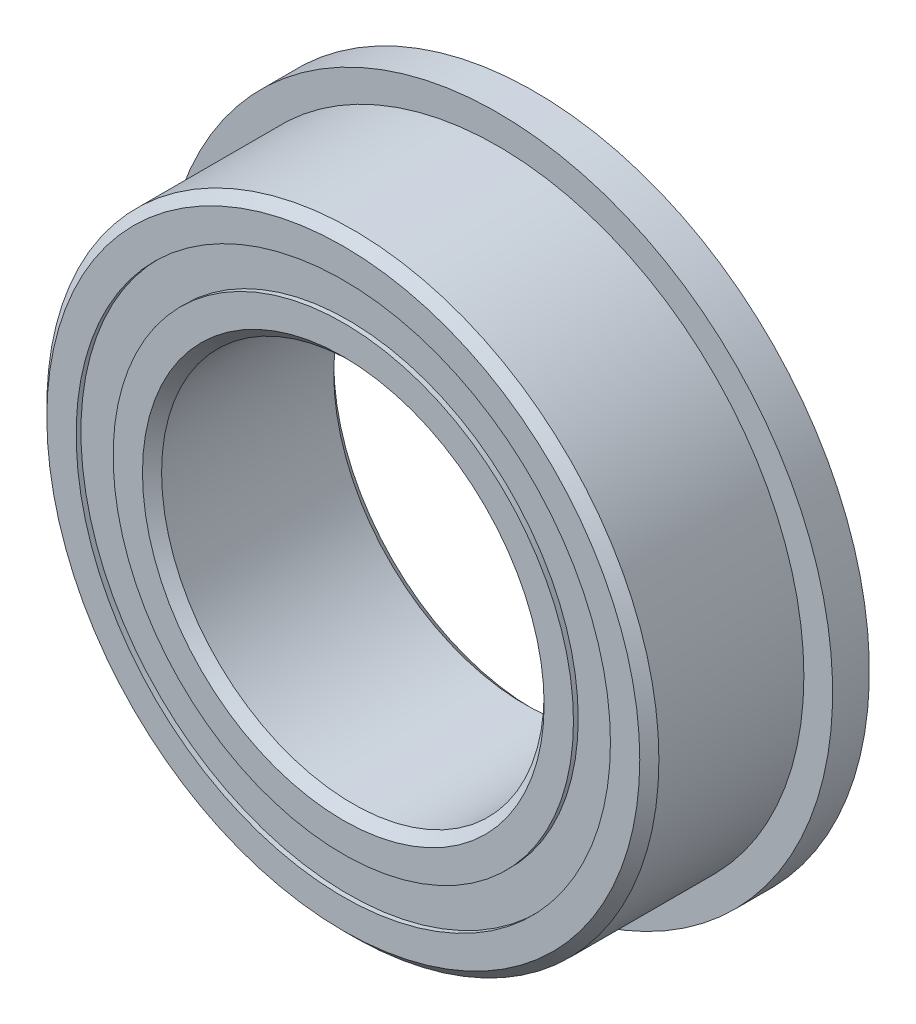
ISO-10303-21;
HEADER;
FILE_DESCRIPTION(('STEP AP214'),'2;1');
FILE_NAME('part.step','',(''),(''),'','','');
FILE_SCHEMA(('AUTOMOTIVE_DESIGN { 1 0 10303 214 1 1 1 1 }'));
ENDSEC;
DATA;
#1=APPLICATION_CONTEXT('core data for automotive mechanical design processes');
#2=APPLICATION_PROTOCOL_DEFINITION('international standard','automotive_design',2000,#1);
#3=PRODUCT_CONTEXT('',#1,'mechanical');
#4=PRODUCT('Part','Part','',(#3));
#5=PRODUCT_RELATED_PRODUCT_CATEGORY('part','',(#4));
#6=PRODUCT_DEFINITION_FORMATION('','',#4);
#7=PRODUCT_DEFINITION_CONTEXT('part definition',#1,'design');
#8=PRODUCT_DEFINITION('design','',#6,#7);
#9=PRODUCT_DEFINITION_SHAPE('','',#8);
#10=(LENGTH_UNIT() NAMED_UNIT(*) SI_UNIT(.MILLI.,.METRE.));
#11=(NAMED_UNIT(*) PLANE_ANGLE_UNIT() SI_UNIT($,.RADIAN.));
#12=(NAMED_UNIT(*) SI_UNIT($,.STERADIAN.) SOLID_ANGLE_UNIT());
#13=UNCERTAINTY_MEASURE_WITH_UNIT(LENGTH_MEASURE(1.E-05),#10,'distance_accuracy_value','');
#14=(GEOMETRIC_REPRESENTATION_CONTEXT(3) GLOBAL_UNCERTAINTY_ASSIGNED_CONTEXT((#13)) GLOBAL_UNIT_ASSIGNED_CONTEXT((#10,
#11,#12)) REPRESENTATION_CONTEXT('',''));
#15=CARTESIAN_POINT('',(0.,0.,0.));
#16=DIRECTION('',(0.,0.,1.));
#17=DIRECTION('',(1.,0.,0.));
#18=AXIS2_PLACEMENT_3D('',#15,#16,#17);
#19=CARTESIAN_POINT('',(0.,5.54316620879121,-1.88515625));
#20=DIRECTION('',(0.,0.,1.));
#21=DIRECTION('',(1.,0.,0.));
#22=AXIS2_PLACEMENT_3D('',#19,#20,#21);
#23=PLANE('',#22);
#24=CARTESIAN_POINT('',(0.,0.,-1.88515625));
#25=DIRECTION('',(0.,0.,1.));
#26=DIRECTION('',(1.,0.,0.));
#27=AXIS2_PLACEMENT_3D('',#24,#25,#26);
#28=CIRCLE('',#27,5.54316620879121);
#29=CARTESIAN_POINT('',(5.54316620879121,0.,-1.88515625));
#30=VERTEX_POINT('',#29);
#31=EDGE_CURVE('E60',#30,#30,#28,.T.);
#32=ORIENTED_EDGE('',*,*,#31,.F.);
#33=EDGE_LOOP('',(#32));
#34=FACE_BOUND('',#33,.T.);
#35=CARTESIAN_POINT('',(0.,0.,-1.88515625));
#36=DIRECTION('',(0.,0.,1.));
#37=DIRECTION('',(1.,0.,0.));
#38=AXIS2_PLACEMENT_3D('',#35,#36,#37);
#39=CIRCLE('',#38,4.77558379120879);
#40=CARTESIAN_POINT('',(4.77558379120879,0.,-1.88515625));
#41=VERTEX_POINT('',#40);
#42=EDGE_CURVE('E11',#41,#41,#39,.T.);
#43=ORIENTED_EDGE('',*,*,#42,.T.);
#44=EDGE_LOOP('',(#43));
#45=FACE_BOUND('',#44,.T.);
#46=ADVANCED_FACE('F46',(#34,#45),#23,.F.);
#47=CARTESIAN_POINT('',(0.,0.,1.984375));
#48=DIRECTION('',(0.,0.,1.));
#49=DIRECTION('',(1.,0.,0.));
#50=AXIS2_PLACEMENT_3D('',#47,#48,#49);
#51=CYLINDRICAL_SURFACE('',#50,4.77558379120879);
#52=ORIENTED_EDGE('',*,*,#42,.F.);
#53=EDGE_LOOP('',(#52));
#54=FACE_BOUND('',#53,.T.);
#55=CARTESIAN_POINT('',(0.,0.,-0.961832467237323));
#56=DIRECTION('',(0.,0.,1.));
#57=DIRECTION('',(1.,0.,0.));
#58=AXIS2_PLACEMENT_3D('',#55,#56,#57);
#59=CIRCLE('',#58,4.77558379120879);
#60=CARTESIAN_POINT('',(4.77558379120879,0.,-0.961832467237323));
#61=VERTEX_POINT('',#60);
#62=EDGE_CURVE('E52',#61,#61,#59,.T.);
#63=ORIENTED_EDGE('',*,*,#62,.T.);
#64=EDGE_LOOP('',(#63));
#65=FACE_BOUND('',#64,.T.);
#66=ADVANCED_FACE('F69',(#54,#65),#51,.F.);
#67=CARTESIAN_POINT('',(0.,5.54316620879121,-0.961832467237323));
#68=DIRECTION('',(0.,0.,-1.));
#69=DIRECTION('',(-1.,0.,0.));
#70=AXIS2_PLACEMENT_3D('',#67,#68,#69);
#71=PLANE('',#70);
#72=ORIENTED_EDGE('',*,*,#62,.F.);
#73=EDGE_LOOP('',(#72));
#74=FACE_BOUND('',#73,.T.);
#75=CARTESIAN_POINT('',(0.,0.,-0.961832467237323));
#76=DIRECTION('',(0.,0.,1.));
#77=DIRECTION('',(1.,0.,0.));
#78=AXIS2_PLACEMENT_3D('',#75,#76,#77);
#79=CIRCLE('',#78,5.54316620879121);
#80=CARTESIAN_POINT('',(5.54316620879121,0.,-0.961832467237323));
#81=VERTEX_POINT('',#80);
#82=EDGE_CURVE('E56',#81,#81,#79,.T.);
#83=ORIENTED_EDGE('',*,*,#82,.T.);
#84=EDGE_LOOP('',(#83));
#85=FACE_BOUND('',#84,.T.);
#86=ADVANCED_FACE('F73',(#74,#85),#71,.F.);
#87=CARTESIAN_POINT('',(0.,0.,1.984375));
#88=DIRECTION('',(0.,0.,1.));
#89=DIRECTION('',(1.,0.,0.));
#90=AXIS2_PLACEMENT_3D('',#87,#88,#89);
#91=CYLINDRICAL_SURFACE('',#90,5.54316620879121);
#92=ORIENTED_EDGE('',*,*,#82,.F.);
#93=EDGE_LOOP('',(#92));
#94=FACE_BOUND('',#93,.T.);
#95=ORIENTED_EDGE('',*,*,#31,.T.);
#96=EDGE_LOOP('',(#95));
#97=FACE_BOUND('',#96,.T.);
#98=ADVANCED_FACE('F66',(#94,#97),#91,.T.);
#99=CLOSED_SHELL('',(#46,#66,#86,#98));
#100=MANIFOLD_SOLID_BREP('B2',#99);
#101=CARTESIAN_POINT('',(0.,5.54316620879121,1.88515625));
#102=DIRECTION('',(0.,0.,-1.));
#103=DIRECTION('',(-1.,0.,0.));
#104=AXIS2_PLACEMENT_3D('',#101,#102,#103);
#105=PLANE('',#104);
#106=CARTESIAN_POINT('',(0.,0.,1.88515625));
#107=DIRECTION('',(0.,0.,1.));
#108=DIRECTION('',(1.,0.,0.));
#109=AXIS2_PLACEMENT_3D('',#106,#107,#108);
#110=CIRCLE('',#109,4.77558379120879);
#111=CARTESIAN_POINT('',(4.77558379120879,0.,1.88515625));
#112=VERTEX_POINT('',#111);
#113=EDGE_CURVE('E45',#112,#112,#110,.T.);
#114=ORIENTED_EDGE('',*,*,#113,.F.);
#115=EDGE_LOOP('',(#114));
#116=FACE_BOUND('',#115,.T.);
#117=CARTESIAN_POINT('',(0.,0.,1.88515625));
#118=DIRECTION('',(0.,0.,1.));
#119=DIRECTION('',(1.,0.,0.));
#120=AXIS2_PLACEMENT_3D('',#117,#118,#119);
#121=CIRCLE('',#120,5.54316620879121);
#122=CARTESIAN_POINT('',(5.54316620879121,0.,1.88515625));
#123=VERTEX_POINT('',#122);
#124=EDGE_CURVE('E128',#123,#123,#121,.T.);
#125=ORIENTED_EDGE('',*,*,#124,.T.);
#126=EDGE_LOOP('',(#125));
#127=FACE_BOUND('',#126,.T.);
#128=ADVANCED_FACE('F114',(#116,#127),#105,.F.);
#129=CARTESIAN_POINT('',(0.,0.,1.984375));
#130=DIRECTION('',(0.,0.,1.));
#131=DIRECTION('',(1.,0.,0.));
#132=AXIS2_PLACEMENT_3D('',#129,#130,#131);
#133=CYLINDRICAL_SURFACE('',#132,4.77558379120879);
#134=CARTESIAN_POINT('',(0.,0.,0.961832467237323));
#135=DIRECTION('',(0.,0.,1.));
#136=DIRECTION('',(1.,0.,0.));
#137=AXIS2_PLACEMENT_3D('',#134,#135,#136);
#138=CIRCLE('',#137,4.77558379120879);
#139=CARTESIAN_POINT('',(4.77558379120879,0.,0.961832467237323));
#140=VERTEX_POINT('',#139);
#141=EDGE_CURVE('E120',#140,#140,#138,.T.);
#142=ORIENTED_EDGE('',*,*,#141,.F.);
#143=EDGE_LOOP('',(#142));
#144=FACE_BOUND('',#143,.T.);
#145=ORIENTED_EDGE('',*,*,#113,.T.);
#146=EDGE_LOOP('',(#145));
#147=FACE_BOUND('',#146,.T.);
#148=ADVANCED_FACE('F143',(#144,#147),#133,.F.);
#149=CARTESIAN_POINT('',(0.,5.54316620879121,0.961832467237323));
#150=DIRECTION('',(0.,0.,1.));
#151=DIRECTION('',(1.,0.,0.));
#152=AXIS2_PLACEMENT_3D('',#149,#150,#151);
#153=PLANE('',#152);
#154=CARTESIAN_POINT('',(0.,0.,0.961832467237323));
#155=DIRECTION('',(0.,0.,1.));
#156=DIRECTION('',(1.,0.,0.));
#157=AXIS2_PLACEMENT_3D('',#154,#155,#156);
#158=CIRCLE('',#157,5.54316620879121);
#159=CARTESIAN_POINT('',(5.54316620879121,0.,0.961832467237323));
#160=VERTEX_POINT('',#159);
#161=EDGE_CURVE('E124',#160,#160,#158,.T.);
#162=ORIENTED_EDGE('',*,*,#161,.F.);
#163=EDGE_LOOP('',(#162));
#164=FACE_BOUND('',#163,.T.);
#165=ORIENTED_EDGE('',*,*,#141,.T.);
#166=EDGE_LOOP('',(#165));
#167=FACE_BOUND('',#166,.T.);
#168=ADVANCED_FACE('F138',(#164,#167),#153,.F.);
#169=CARTESIAN_POINT('',(0.,0.,1.984375));
#170=DIRECTION('',(0.,0.,1.));
#171=DIRECTION('',(1.,0.,0.));
#172=AXIS2_PLACEMENT_3D('',#169,#170,#171);
#173=CYLINDRICAL_SURFACE('',#172,5.54316620879121);
#174=ORIENTED_EDGE('',*,*,#124,.F.);
#175=EDGE_LOOP('',(#174));
#176=FACE_BOUND('',#175,.T.);
#177=ORIENTED_EDGE('',*,*,#161,.T.);
#178=EDGE_LOOP('',(#177));
#179=FACE_BOUND('',#178,.T.);
#180=ADVANCED_FACE('F135',(#176,#179),#173,.T.);
#181=CLOSED_SHELL('',(#128,#148,#168,#180));
#182=MANIFOLD_SOLID_BREP('B6',#181);
#183=CARTESIAN_POINT('',(-1.97440733385857,4.76664096305045,0.));
#184=DIRECTION('',(0.,0.,1.));
#185=DIRECTION('',(-0.382683432365077,0.923879532511292,0.));
#186=AXIS2_PLACEMENT_3D('',#183,#184,#185);
#187=SPHERICAL_SURFACE('',#186,0.961832467237323);
#188=CARTESIAN_POINT('',(-1.97440733385857,4.76664096305045,0.961832467237323));
#189=VERTEX_POINT('',#188);
#190=VERTEX_LOOP('',#189);
#191=FACE_BOUND('',#190,.T.);
#192=ADVANCED_FACE('F182',(#191),#187,.T.);
#193=CLOSED_SHELL('',(#192));
#194=MANIFOLD_SOLID_BREP('B40',#193);
#195=CARTESIAN_POINT('',(-3.6482290491843,3.64822904918439,0.));
#196=DIRECTION('',(0.,0.,1.));
#197=DIRECTION('',(-0.707106781186539,0.707106781186556,0.));
#198=AXIS2_PLACEMENT_3D('',#195,#196,#197);
#199=SPHERICAL_SURFACE('',#198,0.961832467237323);
#200=CARTESIAN_POINT('',(-3.6482290491843,3.64822904918439,0.961832467237323));
#201=VERTEX_POINT('',#200);
#202=VERTEX_LOOP('',#201);
#203=FACE_BOUND('',#202,.T.);
#204=ADVANCED_FACE('F203',(#203),#199,.T.);
#205=CLOSED_SHELL('',(#204));
#206=MANIFOLD_SOLID_BREP('B110',#205);
#207=CARTESIAN_POINT('',(-4.7666409630504,1.97440733385869,0.));
#208=DIRECTION('',(0.,0.,1.));
#209=DIRECTION('',(-0.923879532511283,0.3826834323651,0.));
#210=AXIS2_PLACEMENT_3D('',#207,#208,#209);
#211=SPHERICAL_SURFACE('',#210,0.961832467237323);
#212=CARTESIAN_POINT('',(-4.7666409630504,1.97440733385869,0.961832467237323));
#213=VERTEX_POINT('',#212);
#214=VERTEX_LOOP('',#213);
#215=FACE_BOUND('',#214,.T.);
#216=ADVANCED_FACE('F224',(#215),#211,.T.);
#217=CLOSED_SHELL('',(#216));
#218=MANIFOLD_SOLID_BREP('B178',#217);
#219=CARTESIAN_POINT('',(-5.159375,0.,0.));
#220=DIRECTION('',(0.,0.,1.));
#221=DIRECTION('',(-1.,0.,0.));
#222=AXIS2_PLACEMENT_3D('',#219,#220,#221);
#223=SPHERICAL_SURFACE('',#222,0.961832467237323);
#224=CARTESIAN_POINT('',(-5.159375,0.,0.961832467237323));
#225=VERTEX_POINT('',#224);
#226=VERTEX_LOOP('',#225);
#227=FACE_BOUND('',#226,.T.);
#228=ADVANCED_FACE('F245',(#227),#223,.T.);
#229=CLOSED_SHELL('',(#228));
#230=MANIFOLD_SOLID_BREP('B199',#229);
#231=CARTESIAN_POINT('',(-4.76664096305044,-1.97440733385859,0.));
#232=DIRECTION('',(0.,0.,1.));
#233=DIRECTION('',(-0.923879532511291,-0.382683432365081,0.));
#234=AXIS2_PLACEMENT_3D('',#231,#232,#233);
#235=SPHERICAL_SURFACE('',#234,0.961832467237323);
#236=CARTESIAN_POINT('',(-4.76664096305044,-1.97440733385859,0.961832467237323));
#237=VERTEX_POINT('',#236);
#238=VERTEX_LOOP('',#237);
#239=FACE_BOUND('',#238,.T.);
#240=ADVANCED_FACE('F266',(#239),#235,.T.);
#241=CLOSED_SHELL('',(#240));
#242=MANIFOLD_SOLID_BREP('B220',#241);
#243=CARTESIAN_POINT('',(-3.64822904918437,-3.64822904918431,0.));
#244=DIRECTION('',(0.,0.,1.));
#245=DIRECTION('',(-0.707106781186554,-0.707106781186541,0.));
#246=AXIS2_PLACEMENT_3D('',#243,#244,#245);
#247=SPHERICAL_SURFACE('',#246,0.961832467237323);
#248=CARTESIAN_POINT('',(-3.64822904918437,-3.64822904918431,0.961832467237323));
#249=VERTEX_POINT('',#248);
#250=VERTEX_LOOP('',#249);
#251=FACE_BOUND('',#250,.T.);
#252=ADVANCED_FACE('F287',(#251),#247,.T.);
#253=CLOSED_SHELL('',(#252));
#254=MANIFOLD_SOLID_BREP('B241',#253);
#255=CARTESIAN_POINT('',(-1.97440733385867,-4.7666409630504,0.));
#256=DIRECTION('',(0.,0.,1.));
#257=DIRECTION('',(-0.382683432365097,-0.923879532511284,0.));
#258=AXIS2_PLACEMENT_3D('',#255,#256,#257);
#259=SPHERICAL_SURFACE('',#258,0.961832467237323);
#260=CARTESIAN_POINT('',(-1.97440733385867,-4.7666409630504,0.961832467237323));
#261=VERTEX_POINT('',#260);
#262=VERTEX_LOOP('',#261);
#263=FACE_BOUND('',#262,.T.);
#264=ADVANCED_FACE('F308',(#263),#259,.T.);
#265=CLOSED_SHELL('',(#264));
#266=MANIFOLD_SOLID_BREP('B262',#265);
#267=CARTESIAN_POINT('',(0.,-5.159375,0.));
#268=DIRECTION('',(0.,0.,1.));
#269=DIRECTION('',(0.,-1.,0.));
#270=AXIS2_PLACEMENT_3D('',#267,#268,#269);
#271=SPHERICAL_SURFACE('',#270,0.961832467237323);
#272=CARTESIAN_POINT('',(0.,-5.159375,0.961832467237323));
#273=VERTEX_POINT('',#272);
#274=VERTEX_LOOP('',#273);
#275=FACE_BOUND('',#274,.T.);
#276=ADVANCED_FACE('F329',(#275),#271,.T.);
#277=CLOSED_SHELL('',(#276));
#278=MANIFOLD_SOLID_BREP('B283',#277);
#279=CARTESIAN_POINT('',(1.97440733385861,-4.76664096305043,0.));
#280=DIRECTION('',(0.,0.,1.));
#281=DIRECTION('',(0.382683432365084,-0.923879532511289,0.));
#282=AXIS2_PLACEMENT_3D('',#279,#280,#281);
#283=SPHERICAL_SURFACE('',#282,0.961832467237323);
#284=CARTESIAN_POINT('',(1.97440733385861,-4.76664096305043,0.961832467237323));
#285=VERTEX_POINT('',#284);
#286=VERTEX_LOOP('',#285);
#287=FACE_BOUND('',#286,.T.);
#288=ADVANCED_FACE('F350',(#287),#283,.T.);
#289=CLOSED_SHELL('',(#288));
#290=MANIFOLD_SOLID_BREP('B304',#289);
#291=CARTESIAN_POINT('',(3.64822904918432,-3.64822904918436,0.));
#292=DIRECTION('',(0.,0.,1.));
#293=DIRECTION('',(0.707106781186544,-0.707106781186551,0.));
#294=AXIS2_PLACEMENT_3D('',#291,#292,#293);
#295=SPHERICAL_SURFACE('',#294,0.961832467237323);
#296=CARTESIAN_POINT('',(3.64822904918432,-3.64822904918436,0.961832467237323));
#297=VERTEX_POINT('',#296);
#298=VERTEX_LOOP('',#297);
#299=FACE_BOUND('',#298,.T.);
#300=ADVANCED_FACE('F371',(#299),#295,.T.);
#301=CLOSED_SHELL('',(#300));
#302=MANIFOLD_SOLID_BREP('B325',#301);
#303=CARTESIAN_POINT('',(4.76664096305041,-1.97440733385866,0.));
#304=DIRECTION('',(0.,0.,1.));
#305=DIRECTION('',(0.923879532511285,-0.382683432365094,0.));
#306=AXIS2_PLACEMENT_3D('',#303,#304,#305);
#307=SPHERICAL_SURFACE('',#306,0.961832467237323);
#308=CARTESIAN_POINT('',(4.76664096305041,-1.97440733385866,0.961832467237323));
#309=VERTEX_POINT('',#308);
#310=VERTEX_LOOP('',#309);
#311=FACE_BOUND('',#310,.T.);
#312=ADVANCED_FACE('F392',(#311),#307,.T.);
#313=CLOSED_SHELL('',(#312));
#314=MANIFOLD_SOLID_BREP('B346',#313);
#315=CARTESIAN_POINT('',(5.159375,0.,0.));
#316=DIRECTION('',(0.,0.,1.));
#317=DIRECTION('',(1.,0.,0.));
#318=AXIS2_PLACEMENT_3D('',#315,#316,#317);
#319=SPHERICAL_SURFACE('',#318,0.961832467237323);
#320=CARTESIAN_POINT('',(5.159375,0.,0.961832467237323));
#321=VERTEX_POINT('',#320);
#322=VERTEX_LOOP('',#321);
#323=FACE_BOUND('',#322,.T.);
#324=ADVANCED_FACE('F413',(#323),#319,.T.);
#325=CLOSED_SHELL('',(#324));
#326=MANIFOLD_SOLID_BREP('B367',#325);
#327=CARTESIAN_POINT('',(4.76664096305042,1.97440733385862,0.));
#328=DIRECTION('',(0.,0.,1.));
#329=DIRECTION('',(0.923879532511288,0.382683432365087,0.));
#330=AXIS2_PLACEMENT_3D('',#327,#328,#329);
#331=SPHERICAL_SURFACE('',#330,0.961832467237323);
#332=CARTESIAN_POINT('',(4.76664096305042,1.97440733385862,0.961832467237323));
#333=VERTEX_POINT('',#332);
#334=VERTEX_LOOP('',#333);
#335=FACE_BOUND('',#334,.T.);
#336=ADVANCED_FACE('F434',(#335),#331,.T.);
#337=CLOSED_SHELL('',(#336));
#338=MANIFOLD_SOLID_BREP('B388',#337);
#339=CARTESIAN_POINT('',(3.64822904918435,3.64822904918434,0.));
#340=DIRECTION('',(0.,0.,1.));
#341=DIRECTION('',(0.707106781186549,0.707106781186546,0.));
#342=AXIS2_PLACEMENT_3D('',#339,#340,#341);
#343=SPHERICAL_SURFACE('',#342,0.961832467237323);
#344=CARTESIAN_POINT('',(3.64822904918435,3.64822904918434,0.961832467237323));
#345=VERTEX_POINT('',#344);
#346=VERTEX_LOOP('',#345);
#347=FACE_BOUND('',#346,.T.);
#348=ADVANCED_FACE('F455',(#347),#343,.T.);
#349=CLOSED_SHELL('',(#348));
#350=MANIFOLD_SOLID_BREP('B409',#349);
#351=CARTESIAN_POINT('',(1.97440733385864,4.76664096305042,0.));
#352=DIRECTION('',(0.,0.,1.));
#353=DIRECTION('',(0.382683432365091,0.923879532511287,0.));
#354=AXIS2_PLACEMENT_3D('',#351,#352,#353);
#355=SPHERICAL_SURFACE('',#354,0.961832467237323);
#356=CARTESIAN_POINT('',(1.97440733385864,4.76664096305042,0.961832467237323));
#357=VERTEX_POINT('',#356);
#358=VERTEX_LOOP('',#357);
#359=FACE_BOUND('',#358,.T.);
#360=ADVANCED_FACE('F476',(#359),#355,.T.);
#361=CLOSED_SHELL('',(#360));
#362=MANIFOLD_SOLID_BREP('B430',#361);
#363=CARTESIAN_POINT('',(0.,5.159375,0.));
#364=DIRECTION('',(0.,0.,1.));
#365=DIRECTION('',(0.,1.,0.));
#366=AXIS2_PLACEMENT_3D('',#363,#364,#365);
#367=SPHERICAL_SURFACE('',#366,0.961832467237323);
#368=CARTESIAN_POINT('',(0.,5.159375,0.961832467237323));
#369=VERTEX_POINT('',#368);
#370=VERTEX_LOOP('',#369);
#371=FACE_BOUND('',#370,.T.);
#372=ADVANCED_FACE('F499',(#371),#367,.T.);
#373=CLOSED_SHELL('',(#372));
#374=MANIFOLD_SOLID_BREP('B451',#373);
#375=CARTESIAN_POINT('',(0.,4.77558379120879,1.984375));
#376=DIRECTION('',(0.,0.,-1.));
#377=DIRECTION('',(-1.,0.,0.));
#378=AXIS2_PLACEMENT_3D('',#375,#376,#377);
#379=PLANE('',#378);
#380=CARTESIAN_POINT('',(0.,0.,1.984375));
#381=DIRECTION('',(0.,0.,1.));
#382=DIRECTION('',(1.,0.,0.));
#383=AXIS2_PLACEMENT_3D('',#380,#381,#382);
#384=CIRCLE('',#383,4.1671875);
#385=CARTESIAN_POINT('',(4.1671875,0.,1.984375));
#386=VERTEX_POINT('',#385);
#387=EDGE_CURVE('E547',#386,#386,#384,.T.);
#388=ORIENTED_EDGE('',*,*,#387,.F.);
#389=EDGE_LOOP('',(#388));
#390=FACE_BOUND('',#389,.T.);
#391=CARTESIAN_POINT('',(0.,0.,1.984375));
#392=DIRECTION('',(0.,0.,1.));
#393=DIRECTION('',(1.,0.,0.));
#394=AXIS2_PLACEMENT_3D('',#391,#392,#393);
#395=CIRCLE('',#394,4.77558379120879);
#396=CARTESIAN_POINT('',(4.77558379120879,0.,1.984375));
#397=VERTEX_POINT('',#396);
#398=EDGE_CURVE('E498',#397,#397,#395,.T.);
#399=ORIENTED_EDGE('',*,*,#398,.T.);
#400=EDGE_LOOP('',(#399));
#401=FACE_BOUND('',#400,.T.);
#402=ADVANCED_FACE('F519',(#390,#401),#379,.F.);
#403=CARTESIAN_POINT('',(0.,0.,1.984375));
#404=DIRECTION('',(0.,0.,1.));
#405=DIRECTION('',(1.,0.,0.));
#406=AXIS2_PLACEMENT_3D('',#403,#404,#405);
#407=CYLINDRICAL_SURFACE('',#406,4.77558379120879);
#408=ORIENTED_EDGE('',*,*,#398,.F.);
#409=EDGE_LOOP('',(#408));
#410=FACE_BOUND('',#409,.T.);
#411=CARTESIAN_POINT('',(0.,0.,0.881944444444444));
#412=DIRECTION('',(0.,0.,1.));
#413=DIRECTION('',(1.,0.,0.));
#414=AXIS2_PLACEMENT_3D('',#411,#412,#413);
#415=CIRCLE('',#414,4.77558379120879);
#416=CARTESIAN_POINT('',(4.77558379120879,0.,0.881944444444444));
#417=VERTEX_POINT('',#416);
#418=EDGE_CURVE('E525',#417,#417,#415,.T.);
#419=ORIENTED_EDGE('',*,*,#418,.T.);
#420=EDGE_LOOP('',(#419));
#421=FACE_BOUND('',#420,.T.);
#422=ADVANCED_FACE('F554',(#410,#421),#407,.T.);
#423=CARTESIAN_POINT('',(0.,0.,0.));
#424=DIRECTION('',(0.,0.,1.));
#425=DIRECTION('',(1.,0.,0.));
#426=AXIS2_PLACEMENT_3D('',#423,#424,#425);
#427=TOROIDAL_SURFACE('',#426,5.159375,0.961832467237321);
#428=ORIENTED_EDGE('',*,*,#418,.F.);
#429=EDGE_LOOP('',(#428));
#430=FACE_BOUND('',#429,.T.);
#431=CARTESIAN_POINT('',(0.,0.,-0.881944444444446));
#432=DIRECTION('',(0.,0.,1.));
#433=DIRECTION('',(1.,0.,0.));
#434=AXIS2_PLACEMENT_3D('',#431,#432,#433);
#435=CIRCLE('',#434,4.77558379120879);
#436=CARTESIAN_POINT('',(4.77558379120879,0.,-0.881944444444446));
#437=VERTEX_POINT('',#436);
#438=EDGE_CURVE('E529',#437,#437,#435,.T.);
#439=ORIENTED_EDGE('',*,*,#438,.T.);
#440=EDGE_LOOP('',(#439));
#441=FACE_BOUND('',#440,.T.);
#442=ADVANCED_FACE('F558',(#430,#441),#427,.F.);
#443=CARTESIAN_POINT('',(0.,0.,1.984375));
#444=DIRECTION('',(0.,0.,1.));
#445=DIRECTION('',(1.,0.,0.));
#446=AXIS2_PLACEMENT_3D('',#443,#444,#445);
#447=CYLINDRICAL_SURFACE('',#446,4.77558379120879);
#448=ORIENTED_EDGE('',*,*,#438,.F.);
#449=EDGE_LOOP('',(#448));
#450=FACE_BOUND('',#449,.T.);
#451=CARTESIAN_POINT('',(0.,0.,-1.984375));
#452=DIRECTION('',(0.,0.,1.));
#453=DIRECTION('',(1.,0.,0.));
#454=AXIS2_PLACEMENT_3D('',#451,#452,#453);
#455=CIRCLE('',#454,4.77558379120879);
#456=CARTESIAN_POINT('',(4.77558379120879,0.,-1.984375));
#457=VERTEX_POINT('',#456);
#458=EDGE_CURVE('E533',#457,#457,#455,.T.);
#459=ORIENTED_EDGE('',*,*,#458,.T.);
#460=EDGE_LOOP('',(#459));
#461=FACE_BOUND('',#460,.T.);
#462=ADVANCED_FACE('F563',(#450,#461),#447,.T.);
#463=CARTESIAN_POINT('',(0.,4.1671875,-1.984375));
#464=DIRECTION('',(0.,0.,1.));
#465=DIRECTION('',(1.,0.,0.));
#466=AXIS2_PLACEMENT_3D('',#463,#464,#465);
#467=PLANE('',#466);
#468=ORIENTED_EDGE('',*,*,#458,.F.);
#469=EDGE_LOOP('',(#468));
#470=FACE_BOUND('',#469,.T.);
#471=CARTESIAN_POINT('',(0.,0.,-1.984375));
#472=DIRECTION('',(0.,0.,1.));
#473=DIRECTION('',(1.,0.,0.));
#474=AXIS2_PLACEMENT_3D('',#471,#472,#473);
#475=CIRCLE('',#474,4.1671875);
#476=CARTESIAN_POINT('',(4.1671875,0.,-1.984375));
#477=VERTEX_POINT('',#476);
#478=EDGE_CURVE('E538',#477,#477,#475,.T.);
#479=ORIENTED_EDGE('',*,*,#478,.T.);
#480=EDGE_LOOP('',(#479));
#481=FACE_BOUND('',#480,.T.);
#482=ADVANCED_FACE('F569',(#470,#481),#467,.F.);
#483=CARTESIAN_POINT('',(0.,0.,-1.7859375));
#484=DIRECTION('',(0.,0.,-1.));
#485=DIRECTION('',(-1.,0.,0.));
#486=AXIS2_PLACEMENT_3D('',#483,#484,#485);
#487=CONICAL_SURFACE('',#486,3.96875,0.785398163397447);
#488=ORIENTED_EDGE('',*,*,#478,.F.);
#489=EDGE_LOOP('',(#488));
#490=FACE_BOUND('',#489,.T.);
#491=CARTESIAN_POINT('',(0.,0.,-1.7859375));
#492=DIRECTION('',(0.,0.,1.));
#493=DIRECTION('',(1.,0.,0.));
#494=AXIS2_PLACEMENT_3D('',#491,#492,#493);
#495=CIRCLE('',#494,3.96875);
#496=CARTESIAN_POINT('',(3.96875,0.,-1.7859375));
#497=VERTEX_POINT('',#496);
#498=EDGE_CURVE('E541',#497,#497,#495,.T.);
#499=ORIENTED_EDGE('',*,*,#498,.T.);
#500=EDGE_LOOP('',(#499));
#501=FACE_BOUND('',#500,.T.);
#502=ADVANCED_FACE('F573',(#490,#501),#487,.F.);
#503=CARTESIAN_POINT('',(0.,0.,1.984375));
#504=DIRECTION('',(0.,0.,1.));
#505=DIRECTION('',(1.,0.,0.));
#506=AXIS2_PLACEMENT_3D('',#503,#504,#505);
#507=CYLINDRICAL_SURFACE('',#506,3.96875);
#508=ORIENTED_EDGE('',*,*,#498,.F.);
#509=EDGE_LOOP('',(#508));
#510=FACE_BOUND('',#509,.T.);
#511=CARTESIAN_POINT('',(0.,0.,1.7859375));
#512=DIRECTION('',(0.,0.,1.));
#513=DIRECTION('',(1.,0.,0.));
#514=AXIS2_PLACEMENT_3D('',#511,#512,#513);
#515=CIRCLE('',#514,3.96875);
#516=CARTESIAN_POINT('',(3.96875,0.,1.7859375));
#517=VERTEX_POINT('',#516);
#518=EDGE_CURVE('E544',#517,#517,#515,.T.);
#519=ORIENTED_EDGE('',*,*,#518,.T.);
#520=EDGE_LOOP('',(#519));
#521=FACE_BOUND('',#520,.T.);
#522=ADVANCED_FACE('F577',(#510,#521),#507,.F.);
#523=CARTESIAN_POINT('',(0.,0.,1.984375));
#524=DIRECTION('',(0.,0.,1.));
#525=DIRECTION('',(1.,0.,0.));
#526=AXIS2_PLACEMENT_3D('',#523,#524,#525);
#527=CONICAL_SURFACE('',#526,4.1671875,0.78539816339745);
#528=ORIENTED_EDGE('',*,*,#518,.F.);
#529=EDGE_LOOP('',(#528));
#530=FACE_BOUND('',#529,.T.);
#531=ORIENTED_EDGE('',*,*,#387,.T.);
#532=EDGE_LOOP('',(#531));
#533=FACE_BOUND('',#532,.T.);
#534=ADVANCED_FACE('F551',(#530,#533),#527,.F.);
#535=CLOSED_SHELL('',(#402,#422,#442,#462,#482,#502,#522,#534));
#536=MANIFOLD_SOLID_BREP('B472',#535);
#537=CARTESIAN_POINT('',(0.,0.,1.7859375));
#538=DIRECTION('',(0.,0.,-1.));
#539=DIRECTION('',(-1.,0.,0.));
#540=AXIS2_PLACEMENT_3D('',#537,#538,#539);
#541=CONICAL_SURFACE('',#540,6.35,0.785398163397447);
#542=CARTESIAN_POINT('',(0.,0.,1.984375));
#543=DIRECTION('',(0.,0.,1.));
#544=DIRECTION('',(1.,0.,0.));
#545=AXIS2_PLACEMENT_3D('',#542,#543,#544);
#546=CIRCLE('',#545,6.1515625);
#547=CARTESIAN_POINT('',(6.1515625,0.,1.984375));
#548=VERTEX_POINT('',#547);
#549=EDGE_CURVE('E663',#548,#548,#546,.T.);
#550=ORIENTED_EDGE('',*,*,#549,.F.);
#551=EDGE_LOOP('',(#550));
#552=FACE_BOUND('',#551,.T.);
#553=CARTESIAN_POINT('',(0.,0.,1.7859375));
#554=DIRECTION('',(0.,0.,1.));
#555=DIRECTION('',(1.,0.,0.));
#556=AXIS2_PLACEMENT_3D('',#553,#554,#555);
#557=CIRCLE('',#556,6.35);
#558=CARTESIAN_POINT('',(6.35,0.,1.7859375));
#559=VERTEX_POINT('',#558);
#560=EDGE_CURVE('E518',#559,#559,#557,.T.);
#561=ORIENTED_EDGE('',*,*,#560,.T.);
#562=EDGE_LOOP('',(#561));
#563=FACE_BOUND('',#562,.T.);
#564=ADVANCED_FACE('F641',(#552,#563),#541,.T.);
#565=CARTESIAN_POINT('',(0.,0.,1.984375));
#566=DIRECTION('',(0.,0.,1.));
#567=DIRECTION('',(1.,0.,0.));
#568=AXIS2_PLACEMENT_3D('',#565,#566,#567);
#569=CYLINDRICAL_SURFACE('',#568,6.35);
#570=CARTESIAN_POINT('',(0.,0.,-1.222375));
#571=DIRECTION('',(0.,0.,1.));
#572=DIRECTION('',(1.,0.,0.));
#573=AXIS2_PLACEMENT_3D('',#570,#571,#572);
#574=CIRCLE('',#573,6.35);
#575=CARTESIAN_POINT('',(6.35,0.,-1.222375));
#576=VERTEX_POINT('',#575);
#577=EDGE_CURVE('E666',#576,#576,#574,.T.);
#578=ORIENTED_EDGE('',*,*,#577,.T.);
#579=EDGE_LOOP('',(#578));
#580=FACE_BOUND('',#579,.T.);
#581=ORIENTED_EDGE('',*,*,#560,.F.);
#582=EDGE_LOOP('',(#581));
#583=FACE_BOUND('',#582,.T.);
#584=ADVANCED_FACE('F686',(#580,#583),#569,.T.);
#585=CARTESIAN_POINT('',(0.,6.1515625,-1.984375));
#586=DIRECTION('',(0.,0.,1.));
#587=DIRECTION('',(1.,0.,0.));
#588=AXIS2_PLACEMENT_3D('',#585,#586,#587);
#589=PLANE('',#588);
#590=CARTESIAN_POINT('',(0.,0.,-1.984375));
#591=DIRECTION('',(0.,0.,1.));
#592=DIRECTION('',(1.,0.,0.));
#593=AXIS2_PLACEMENT_3D('',#590,#591,#592);
#594=CIRCLE('',#593,5.54316620879121);
#595=CARTESIAN_POINT('',(5.54316620879121,0.,-1.984375));
#596=VERTEX_POINT('',#595);
#597=EDGE_CURVE('E647',#596,#596,#594,.T.);
#598=ORIENTED_EDGE('',*,*,#597,.T.);
#599=EDGE_LOOP('',(#598));
#600=FACE_BOUND('',#599,.T.);
#601=CARTESIAN_POINT('',(0.,0.,-1.984375));
#602=DIRECTION('',(0.,0.,-1.));
#603=DIRECTION('',(-1.,0.,0.));
#604=AXIS2_PLACEMENT_3D('',#601,#602,#603);
#605=CIRCLE('',#604,6.9469);
#606=CARTESIAN_POINT('',(-6.9469,0.,-1.984375));
#607=VERTEX_POINT('',#606);
#608=EDGE_CURVE('E669',#607,#607,#605,.T.);
#609=ORIENTED_EDGE('',*,*,#608,.T.);
#610=EDGE_LOOP('',(#609));
#611=FACE_BOUND('',#610,.T.);
#612=ADVANCED_FACE('F689',(#600,#611),#589,.F.);
#613=CARTESIAN_POINT('',(0.,0.,1.984375));
#614=DIRECTION('',(0.,0.,1.));
#615=DIRECTION('',(1.,0.,0.));
#616=AXIS2_PLACEMENT_3D('',#613,#614,#615);
#617=CYLINDRICAL_SURFACE('',#616,5.54316620879121);
#618=CARTESIAN_POINT('',(0.,0.,-0.881944444444445));
#619=DIRECTION('',(0.,0.,1.));
#620=DIRECTION('',(1.,0.,0.));
#621=AXIS2_PLACEMENT_3D('',#618,#619,#620);
#622=CIRCLE('',#621,5.54316620879121);
#623=CARTESIAN_POINT('',(5.54316620879121,0.,-0.881944444444445));
#624=VERTEX_POINT('',#623);
#625=EDGE_CURVE('E651',#624,#624,#622,.T.);
#626=ORIENTED_EDGE('',*,*,#625,.T.);
#627=EDGE_LOOP('',(#626));
#628=FACE_BOUND('',#627,.T.);
#629=ORIENTED_EDGE('',*,*,#597,.F.);
#630=EDGE_LOOP('',(#629));
#631=FACE_BOUND('',#630,.T.);
#632=ADVANCED_FACE('F694',(#628,#631),#617,.F.);
#633=CARTESIAN_POINT('',(0.,0.,0.));
#634=DIRECTION('',(0.,0.,1.));
#635=DIRECTION('',(1.,0.,0.));
#636=AXIS2_PLACEMENT_3D('',#633,#634,#635);
#637=TOROIDAL_SURFACE('',#636,5.159375,0.961832467237323);
#638=ORIENTED_EDGE('',*,*,#625,.F.);
#639=EDGE_LOOP('',(#638));
#640=FACE_BOUND('',#639,.T.);
#641=CARTESIAN_POINT('',(0.,0.,0.881944444444444));
#642=DIRECTION('',(0.,0.,1.));
#643=DIRECTION('',(1.,0.,0.));
#644=AXIS2_PLACEMENT_3D('',#641,#642,#643);
#645=CIRCLE('',#644,5.54316620879121);
#646=CARTESIAN_POINT('',(5.54316620879121,0.,0.881944444444444));
#647=VERTEX_POINT('',#646);
#648=EDGE_CURVE('E655',#647,#647,#645,.T.);
#649=ORIENTED_EDGE('',*,*,#648,.T.);
#650=EDGE_LOOP('',(#649));
#651=FACE_BOUND('',#650,.T.);
#652=ADVANCED_FACE('F700',(#640,#651),#637,.F.);
#653=CARTESIAN_POINT('',(0.,0.,1.984375));
#654=DIRECTION('',(0.,0.,1.));
#655=DIRECTION('',(1.,0.,0.));
#656=AXIS2_PLACEMENT_3D('',#653,#654,#655);
#657=CYLINDRICAL_SURFACE('',#656,5.54316620879121);
#658=ORIENTED_EDGE('',*,*,#648,.F.);
#659=EDGE_LOOP('',(#658));
#660=FACE_BOUND('',#659,.T.);
#661=CARTESIAN_POINT('',(0.,0.,1.984375));
#662=DIRECTION('',(0.,0.,1.));
#663=DIRECTION('',(1.,0.,0.));
#664=AXIS2_PLACEMENT_3D('',#661,#662,#663);
#665=CIRCLE('',#664,5.54316620879121);
#666=CARTESIAN_POINT('',(5.54316620879121,0.,1.984375));
#667=VERTEX_POINT('',#666);
#668=EDGE_CURVE('E660',#667,#667,#665,.T.);
#669=ORIENTED_EDGE('',*,*,#668,.T.);
#670=EDGE_LOOP('',(#669));
#671=FACE_BOUND('',#670,.T.);
#672=ADVANCED_FACE('F704',(#660,#671),#657,.F.);
#673=CARTESIAN_POINT('',(0.,6.1515625,1.984375));
#674=DIRECTION('',(0.,0.,-1.));
#675=DIRECTION('',(-1.,0.,0.));
#676=AXIS2_PLACEMENT_3D('',#673,#674,#675);
#677=PLANE('',#676);
#678=ORIENTED_EDGE('',*,*,#668,.F.);
#679=EDGE_LOOP('',(#678));
#680=FACE_BOUND('',#679,.T.);
#681=ORIENTED_EDGE('',*,*,#549,.T.);
#682=EDGE_LOOP('',(#681));
#683=FACE_BOUND('',#682,.T.);
#684=ADVANCED_FACE('F682',(#680,#683),#677,.F.);
#685=CARTESIAN_POINT('',(0.,5.54316620879121,-1.222375));
#686=DIRECTION('',(0.,0.,1.));
#687=DIRECTION('',(1.,0.,0.));
#688=AXIS2_PLACEMENT_3D('',#685,#686,#687);
#689=PLANE('',#688);
#690=CARTESIAN_POINT('',(0.,0.,-1.222375));
#691=DIRECTION('',(0.,0.,-1.));
#692=DIRECTION('',(-1.,0.,0.));
#693=AXIS2_PLACEMENT_3D('',#690,#691,#692);
#694=CIRCLE('',#693,6.9469);
#695=CARTESIAN_POINT('',(-6.9469,0.,-1.222375));
#696=VERTEX_POINT('',#695);
#697=EDGE_CURVE('E672',#696,#696,#694,.T.);
#698=ORIENTED_EDGE('',*,*,#697,.F.);
#699=EDGE_LOOP('',(#698));
#700=FACE_BOUND('',#699,.T.);
#701=ORIENTED_EDGE('',*,*,#577,.F.);
#702=EDGE_LOOP('',(#701));
#703=FACE_BOUND('',#702,.T.);
#704=ADVANCED_FACE('F679',(#700,#703),#689,.T.);
#705=CARTESIAN_POINT('',(0.,0.,-1.984375));
#706=DIRECTION('',(0.,0.,-1.));
#707=DIRECTION('',(-1.,0.,0.));
#708=AXIS2_PLACEMENT_3D('',#705,#706,#707);
#709=CYLINDRICAL_SURFACE('',#708,6.9469);
#710=ORIENTED_EDGE('',*,*,#697,.T.);
#711=EDGE_LOOP('',(#710));
#712=FACE_BOUND('',#711,.T.);
#713=ORIENTED_EDGE('',*,*,#608,.F.);
#714=EDGE_LOOP('',(#713));
#715=FACE_BOUND('',#714,.T.);
#716=ADVANCED_FACE('F676',(#712,#715),#709,.T.);
#717=CLOSED_SHELL('',(#564,#584,#612,#632,#652,#672,#684,#704,#716));
#718=MANIFOLD_SOLID_BREP('B493',#717);
#719=ADVANCED_BREP_SHAPE_REPRESENTATION('',(#18,#100,#182,#194,#206,#218,#230,#242,#254,#266,
#278,#290,#302,#314,#326,#338,#350,#362,#374,#536,#718),#14);
#720=SHAPE_DEFINITION_REPRESENTATION(#9,#719);
ENDSEC;
END-ISO-10303-21;
